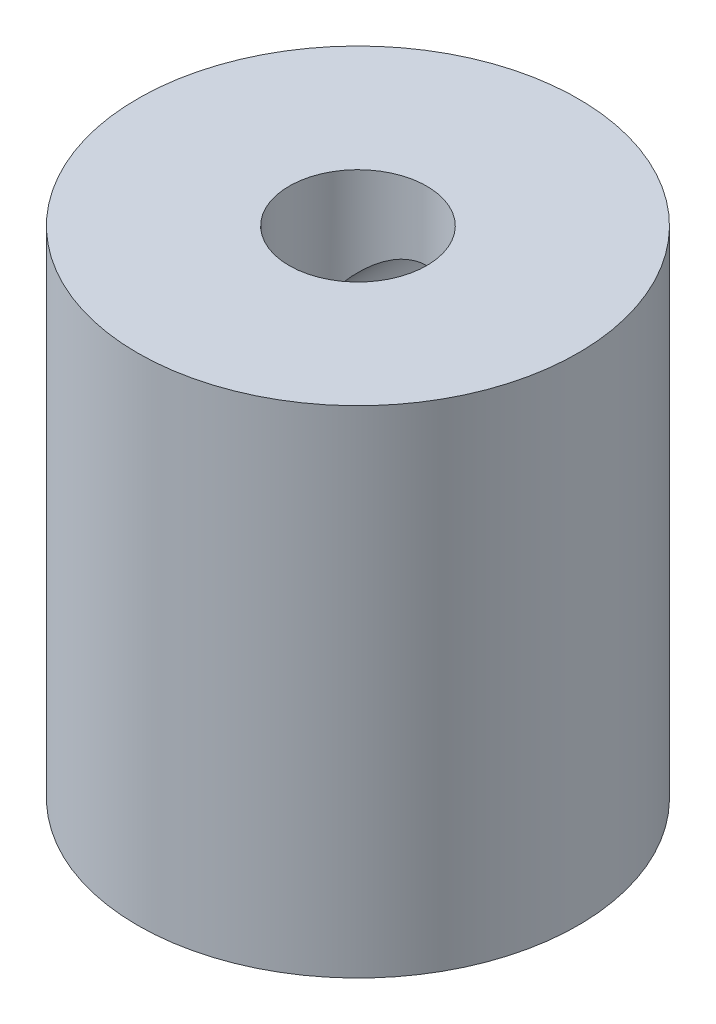
ISO-10303-21;
HEADER;
FILE_DESCRIPTION(('STEP AP214'),'2;1');
FILE_NAME('part.step','',(''),(''),'','','');
FILE_SCHEMA(('AUTOMOTIVE_DESIGN { 1 0 10303 214 1 1 1 1 }'));
ENDSEC;
DATA;
#1=APPLICATION_CONTEXT('core data for automotive mechanical design processes');
#2=APPLICATION_PROTOCOL_DEFINITION('international standard','automotive_design',2000,#1);
#3=PRODUCT_CONTEXT('',#1,'mechanical');
#4=PRODUCT('Part','Part','',(#3));
#5=PRODUCT_RELATED_PRODUCT_CATEGORY('part','',(#4));
#6=PRODUCT_DEFINITION_FORMATION('','',#4);
#7=PRODUCT_DEFINITION_CONTEXT('part definition',#1,'design');
#8=PRODUCT_DEFINITION('design','',#6,#7);
#9=PRODUCT_DEFINITION_SHAPE('','',#8);
#10=(LENGTH_UNIT() NAMED_UNIT(*) SI_UNIT(.MILLI.,.METRE.));
#11=(NAMED_UNIT(*) PLANE_ANGLE_UNIT() SI_UNIT($,.RADIAN.));
#12=(NAMED_UNIT(*) SI_UNIT($,.STERADIAN.) SOLID_ANGLE_UNIT());
#13=UNCERTAINTY_MEASURE_WITH_UNIT(LENGTH_MEASURE(1.E-05),#10,'distance_accuracy_value','');
#14=(GEOMETRIC_REPRESENTATION_CONTEXT(3) GLOBAL_UNCERTAINTY_ASSIGNED_CONTEXT((#13)) GLOBAL_UNIT_ASSIGNED_CONTEXT((#10,
#11,#12)) REPRESENTATION_CONTEXT('',''));
#15=CARTESIAN_POINT('',(0.,0.,0.));
#16=DIRECTION('',(0.,0.,1.));
#17=DIRECTION('',(1.,0.,0.));
#18=AXIS2_PLACEMENT_3D('',#15,#16,#17);
#19=CARTESIAN_POINT('',(0.,9.,0.));
#20=DIRECTION('',(0.,1.,0.));
#21=DIRECTION('',(0.,0.,1.));
#22=AXIS2_PLACEMENT_3D('',#19,#20,#21);
#23=PLANE('',#22);
#24=CARTESIAN_POINT('',(0.,9.,0.));
#25=DIRECTION('',(0.,1.,0.));
#26=DIRECTION('',(0.,0.,1.));
#27=AXIS2_PLACEMENT_3D('',#24,#25,#26);
#28=CIRCLE('',#27,4.);
#29=CARTESIAN_POINT('',(0.,9.,4.));
#30=VERTEX_POINT('',#29);
#31=EDGE_CURVE('E83',#30,#30,#28,.T.);
#32=ORIENTED_EDGE('',*,*,#31,.T.);
#33=EDGE_LOOP('',(#32));
#34=FACE_BOUND('',#33,.T.);
#35=CARTESIAN_POINT('',(0.,9.,0.));
#36=DIRECTION('',(0.,1.,0.));
#37=DIRECTION('',(0.,0.,1.));
#38=AXIS2_PLACEMENT_3D('',#35,#36,#37);
#39=CIRCLE('',#38,1.25);
#40=CARTESIAN_POINT('',(0.,9.,1.25));
#41=VERTEX_POINT('',#40);
#42=EDGE_CURVE('E70',#41,#41,#39,.T.);
#43=ORIENTED_EDGE('',*,*,#42,.F.);
#44=EDGE_LOOP('',(#43));
#45=FACE_BOUND('',#44,.T.);
#46=ADVANCED_FACE('F33',(#34,#45),#23,.T.);
#47=CARTESIAN_POINT('',(0.,0.,0.));
#48=DIRECTION('',(0.,1.,0.));
#49=DIRECTION('',(0.,0.,1.));
#50=AXIS2_PLACEMENT_3D('',#47,#48,#49);
#51=PLANE('',#50);
#52=CARTESIAN_POINT('',(0.,0.,0.));
#53=DIRECTION('',(0.,1.,0.));
#54=DIRECTION('',(0.,0.,1.));
#55=AXIS2_PLACEMENT_3D('',#52,#53,#54);
#56=CIRCLE('',#55,4.);
#57=CARTESIAN_POINT('',(0.,0.,4.));
#58=VERTEX_POINT('',#57);
#59=EDGE_CURVE('E77',#58,#58,#56,.T.);
#60=ORIENTED_EDGE('',*,*,#59,.F.);
#61=EDGE_LOOP('',(#60));
#62=FACE_BOUND('',#61,.T.);
#63=CARTESIAN_POINT('',(0.,0.,0.));
#64=DIRECTION('',(0.,1.,0.));
#65=DIRECTION('',(0.,0.,1.));
#66=AXIS2_PLACEMENT_3D('',#63,#64,#65);
#67=CIRCLE('',#66,1.25);
#68=CARTESIAN_POINT('',(0.,0.,1.25));
#69=VERTEX_POINT('',#68);
#70=EDGE_CURVE('E73',#69,#69,#67,.T.);
#71=ORIENTED_EDGE('',*,*,#70,.T.);
#72=EDGE_LOOP('',(#71));
#73=FACE_BOUND('',#72,.T.);
#74=ADVANCED_FACE('F97',(#62,#73),#51,.F.);
#75=CARTESIAN_POINT('',(0.,9.,0.));
#76=DIRECTION('',(0.,-1.,0.));
#77=DIRECTION('',(0.,0.,-1.));
#78=AXIS2_PLACEMENT_3D('',#75,#76,#77);
#79=CYLINDRICAL_SURFACE('',#78,4.);
#80=CARTESIAN_POINT('',(0.,3.75,-4.));
#81=CARTESIAN_POINT('',(-0.0684391851745465,3.74999955341242,-3.99999965877989));
#82=CARTESIAN_POINT('',(-0.136883052502859,3.74436077305555,-3.99822694984841));
#83=CARTESIAN_POINT('',(-0.271769209588448,3.72201375846076,-3.99132894088807));
#84=CARTESIAN_POINT('',(-0.338211042725907,3.70530301863564,-3.9862028819986));
#85=CARTESIAN_POINT('',(-0.467128543650807,3.66143062880426,-3.97315815697909));
#86=CARTESIAN_POINT('',(-0.529610176985804,3.63428515534703,-3.96524381499025));
#87=CARTESIAN_POINT('',(-0.64913480234646,3.57038268232167,-3.94743969161093));
#88=CARTESIAN_POINT('',(-0.706176935444885,3.53362416821941,-3.93754959899905));
#89=CARTESIAN_POINT('',(-0.814965334952281,3.45034400798264,-3.91650213740282));
#90=CARTESIAN_POINT('',(-0.86652002815666,3.40357911493893,-3.90531715926989));
#91=CARTESIAN_POINT('',(-0.961197382036993,3.30213160758645,-3.88310046374208));
#92=CARTESIAN_POINT('',(-1.0043184728987,3.24744752250545,-3.87206877523457));
#93=CARTESIAN_POINT('',(-1.08194336483114,3.13005543619192,-3.85111144698172));
#94=CARTESIAN_POINT('',(-1.11620784150129,3.06718252247278,-3.84121988301796));
#95=CARTESIAN_POINT('',(-1.17359741076672,2.93620768501813,-3.82407801799234));
#96=CARTESIAN_POINT('',(-1.19672543771945,2.86810714420607,-3.81682702128688));
#97=CARTESIAN_POINT('',(-1.23048459930033,2.73077192254794,-3.80607606984501));
#98=CARTESIAN_POINT('',(-1.24147110007865,2.66163315636115,-3.80246972929508));
#99=CARTESIAN_POINT('',(-1.25174555036988,2.52240688108811,-3.7991005514095));
#100=CARTESIAN_POINT('',(-1.25103660995772,2.45231962917834,-3.79933669227334));
#101=CARTESIAN_POINT('',(-1.23821824732739,2.31612553973102,-3.80353189075438));
#102=CARTESIAN_POINT('',(-1.22656057869383,2.24997087413843,-3.80734341745949));
#103=CARTESIAN_POINT('',(-1.19290813355626,2.12060784346265,-3.81802025652489));
#104=CARTESIAN_POINT('',(-1.17091225844551,2.0573997922912,-3.82488589343115));
#105=CARTESIAN_POINT('',(-1.11688874681277,1.93464805556736,-3.84101044014297));
#106=CARTESIAN_POINT('',(-1.08471925662082,1.87517138930802,-3.85030284660824));
#107=CARTESIAN_POINT('',(-1.01136020737848,1.76231223212088,-3.8702185658007));
#108=CARTESIAN_POINT('',(-0.970168305215773,1.70893132974629,-3.88084222394551));
#109=CARTESIAN_POINT('',(-0.877716954182124,1.60722505658301,-3.90281527800493));
#110=CARTESIAN_POINT('',(-0.826084570592817,1.55924044222032,-3.91417569605696));
#111=CARTESIAN_POINT('',(-0.715364408095531,1.47252810642032,-3.9359157075958));
#112=CARTESIAN_POINT('',(-0.65627607734902,1.43380107078079,-3.94629522838372));
#113=CARTESIAN_POINT('',(-0.531664610465454,1.36647231139872,-3.96501294890191));
#114=CARTESIAN_POINT('',(-0.466094906919279,1.33795186453603,-3.97333460648208));
#115=CARTESIAN_POINT('',(-0.330767977782644,1.29244699914843,-3.98687955828554));
#116=CARTESIAN_POINT('',(-0.261012030724608,1.2754590777616,-3.99210379325151));
#117=CARTESIAN_POINT('',(-0.122185157290344,1.25408195742102,-3.99871389395014));
#118=CARTESIAN_POINT('',(-0.0531918487888415,1.24923145640648,-4.00024022895439));
#119=CARTESIAN_POINT('',(0.0846303057325856,1.25096622663733,-3.99969799730981));
#120=CARTESIAN_POINT('',(0.153459174306506,1.2575498273226,-3.99762995581125));
#121=CARTESIAN_POINT('',(0.287219332975853,1.28159559260639,-3.99022363769772));
#122=CARTESIAN_POINT('',(0.352204978420949,1.29878326761252,-3.98496793110725));
#123=CARTESIAN_POINT('',(0.478351928861366,1.34321435236669,-3.97180121379252));
#124=CARTESIAN_POINT('',(0.539512760449017,1.37045900402491,-3.96388987514203));
#125=CARTESIAN_POINT('',(0.657932406672232,1.43497321654879,-3.94598542759568));
#126=CARTESIAN_POINT('',(0.715059739787956,1.47247098749722,-3.9359462681821));
#127=CARTESIAN_POINT('',(0.822365850960096,1.55615321011702,-3.91493410002887));
#128=CARTESIAN_POINT('',(0.872542738043337,1.60234001774311,-3.90396083845862));
#129=CARTESIAN_POINT('',(0.966587462919657,1.70425889005369,-3.88176994885247));
#130=CARTESIAN_POINT('',(1.01012652339774,1.76029666374526,-3.87055986714446));
#131=CARTESIAN_POINT('',(1.08721250244909,1.87912661637074,-3.84961947087602));
#132=CARTESIAN_POINT('',(1.12075957972524,1.94191868800443,-3.839889132814));
#133=CARTESIAN_POINT('',(1.17670083481141,2.07234517288586,-3.82311782360754));
#134=CARTESIAN_POINT('',(1.19913819558886,2.1399596495047,-3.81606646468027));
#135=CARTESIAN_POINT('',(1.23222894320964,2.2782724933238,-3.80551170941212));
#136=CARTESIAN_POINT('',(1.2428868141461,2.34896967637132,-3.80200696302675));
#137=CARTESIAN_POINT('',(1.2517940615754,2.48800408755424,-3.79908292712494));
#138=CARTESIAN_POINT('',(1.25058279621957,2.55630345381293,-3.79948604683077));
#139=CARTESIAN_POINT('',(1.23708818129474,2.69167458491918,-3.80390090472383));
#140=CARTESIAN_POINT('',(1.22480534822559,2.758746406884,-3.80791247457319));
#141=CARTESIAN_POINT('',(1.18987729913378,2.88879403960178,-3.81896814158112));
#142=CARTESIAN_POINT('',(1.16738642405944,2.95181544109602,-3.82596698183474));
#143=CARTESIAN_POINT('',(1.11280227335064,3.07324041353135,-3.84219704261348));
#144=CARTESIAN_POINT('',(1.08070704444254,3.13164304207768,-3.85142871716522));
#145=CARTESIAN_POINT('',(1.00635675013475,3.24464597044057,-3.8715348703158));
#146=CARTESIAN_POINT('',(0.963753335241273,3.29900812950044,-3.88245948922441));
#147=CARTESIAN_POINT('',(0.870208996404848,3.3999863281118,-3.90448998821726));
#148=CARTESIAN_POINT('',(0.819265842344402,3.44660028899101,-3.91559591606795));
#149=CARTESIAN_POINT('',(0.708486662823332,3.53228253836299,-3.93717271952329));
#150=CARTESIAN_POINT('',(0.64841457448738,3.57105473644997,-3.94761101730634));
#151=CARTESIAN_POINT('',(0.522279138013653,3.63789891513944,-3.96626769296916));
#152=CARTESIAN_POINT('',(0.456218157795448,3.66597510214183,-3.97448694315832));
#153=CARTESIAN_POINT('',(0.325747635373976,3.70859136760847,-3.98720650733461));
#154=CARTESIAN_POINT('',(0.261670337112545,3.72407486730534,-3.99196240806139));
#155=CARTESIAN_POINT('',(0.131729895440247,3.74477835996771,-3.99835900340486));
#156=CARTESIAN_POINT('',(0.0658671161396745,3.750000429804,-4.00000032839644));
#157=CARTESIAN_POINT('',(0.,3.75,-4.));
#158=B_SPLINE_CURVE_WITH_KNOTS('',3,(#80,#81,#82,#83,#84,#85,#86,#87,#88,#89,#90,#91,#92,#93,
#94,#95,#96,#97,#98,#99,#100,#101,#102,#103,#104,#105,#106,#107,#108,#109,#110,#111,#112,#113,
#114,#115,#116,#117,#118,#119,#120,#121,#122,#123,#124,#125,#126,#127,#128,#129,#130,#131,#132,
#133,#134,#135,#136,#137,#138,#139,#140,#141,#142,#143,#144,#145,#146,#147,#148,#149,#150,#151,
#152,#153,#154,#155,#156,#157),.UNSPECIFIED.,.T.,.F.,(4,2,2,2,2,2,2,2,2,2,2,2,2,2,2,2,2,2,2,2,2,
2,2,2,2,2,2,2,2,2,2,2,2,2,2,2,2,2,4),(0.,0.20507544943251,0.410197323349067,0.615002479202437,
0.819839921558392,1.03037822195158,1.24095567431276,1.45673771247494,1.67246286279527,
1.8816915016721,2.09086450295138,2.29176917422169,2.49269519979063,2.69655642720545,
2.90047066010359,3.113667472796,3.32688007413303,3.5417546068977,3.75656384494554,
3.96307568548238,4.16955735649363,4.37090626722872,4.572280050345,4.77856324738343,
4.98490245709259,5.1994177871314,5.41392970983712,5.62760115751032,5.84119123892431,
6.04512203476054,6.24904331751085,6.44997913396672,6.65095584330174,6.85979514006362,
7.06869037373341,7.28440668126413,7.50003806666338,7.69744636651541,7.89481470763048),.UNSPECIFIED.);
#159=CARTESIAN_POINT('',(0.,3.75,-4.));
#160=VERTEX_POINT('',#159);
#161=EDGE_CURVE('E80',#160,#160,#158,.T.);
#162=ORIENTED_EDGE('',*,*,#161,.T.);
#163=EDGE_LOOP('',(#162));
#164=FACE_BOUND('',#163,.T.);
#165=CARTESIAN_POINT('',(0.,7.75,-4.));
#166=CARTESIAN_POINT('',(-0.0684391851745465,7.74999955341242,-3.99999965877989));
#167=CARTESIAN_POINT('',(-0.136883052502859,7.74436077305555,-3.99822694984841));
#168=CARTESIAN_POINT('',(-0.271769209588448,7.72201375846076,-3.99132894088807));
#169=CARTESIAN_POINT('',(-0.338211042725907,7.70530301863564,-3.9862028819986));
#170=CARTESIAN_POINT('',(-0.467128543650807,7.66143062880426,-3.97315815697909));
#171=CARTESIAN_POINT('',(-0.529610176985804,7.63428515534703,-3.96524381499025));
#172=CARTESIAN_POINT('',(-0.64913480234646,7.57038268232167,-3.94743969161093));
#173=CARTESIAN_POINT('',(-0.706176935444885,7.53362416821941,-3.93754959899905));
#174=CARTESIAN_POINT('',(-0.814965334952281,7.45034400798264,-3.91650213740282));
#175=CARTESIAN_POINT('',(-0.86652002815666,7.40357911493893,-3.90531715926989));
#176=CARTESIAN_POINT('',(-0.961197382036994,7.30213160758645,-3.88310046374208));
#177=CARTESIAN_POINT('',(-1.0043184728987,7.24744752250545,-3.87206877523457));
#178=CARTESIAN_POINT('',(-1.08194336483114,7.13005543619192,-3.85111144698172));
#179=CARTESIAN_POINT('',(-1.11620784150129,7.06718252247278,-3.84121988301796));
#180=CARTESIAN_POINT('',(-1.17359741076672,6.93620768501813,-3.82407801799234));
#181=CARTESIAN_POINT('',(-1.19672543771945,6.86810714420607,-3.81682702128689));
#182=CARTESIAN_POINT('',(-1.23048459930033,6.73077192254794,-3.80607606984501));
#183=CARTESIAN_POINT('',(-1.24147110007865,6.66163315636115,-3.80246972929508));
#184=CARTESIAN_POINT('',(-1.25174555036988,6.52240688108811,-3.7991005514095));
#185=CARTESIAN_POINT('',(-1.25103660995772,6.45231962917834,-3.79933669227334));
#186=CARTESIAN_POINT('',(-1.23821824732739,6.31612553973102,-3.80353189075438));
#187=CARTESIAN_POINT('',(-1.22656057869383,6.24997087413843,-3.80734341745949));
#188=CARTESIAN_POINT('',(-1.19290813355626,6.12060784346265,-3.81802025652489));
#189=CARTESIAN_POINT('',(-1.17091225844551,6.0573997922912,-3.82488589343115));
#190=CARTESIAN_POINT('',(-1.11688874681277,5.93464805556737,-3.84101044014296));
#191=CARTESIAN_POINT('',(-1.08471925662082,5.87517138930802,-3.85030284660824));
#192=CARTESIAN_POINT('',(-1.01136020737848,5.76231223212088,-3.8702185658007));
#193=CARTESIAN_POINT('',(-0.970168305215774,5.70893132974629,-3.88084222394551));
#194=CARTESIAN_POINT('',(-0.877716954182124,5.60722505658301,-3.90281527800493));
#195=CARTESIAN_POINT('',(-0.826084570592818,5.55924044222032,-3.91417569605696));
#196=CARTESIAN_POINT('',(-0.715364408095531,5.47252810642032,-3.9359157075958));
#197=CARTESIAN_POINT('',(-0.656276077349021,5.43380107078079,-3.94629522838372));
#198=CARTESIAN_POINT('',(-0.531664610465455,5.36647231139872,-3.96501294890191));
#199=CARTESIAN_POINT('',(-0.466094906919279,5.33795186453603,-3.97333460648208));
#200=CARTESIAN_POINT('',(-0.330767977782644,5.29244699914843,-3.98687955828554));
#201=CARTESIAN_POINT('',(-0.261012030724609,5.2754590777616,-3.99210379325151));
#202=CARTESIAN_POINT('',(-0.122185157290345,5.25408195742102,-3.99871389395014));
#203=CARTESIAN_POINT('',(-0.0531918487888424,5.24923145640648,-4.00024022895439));
#204=CARTESIAN_POINT('',(0.0846303057325846,5.25096622663733,-3.99969799730981));
#205=CARTESIAN_POINT('',(0.153459174306505,5.2575498273226,-3.99762995581125));
#206=CARTESIAN_POINT('',(0.287219332975852,5.28159559260639,-3.99022363769772));
#207=CARTESIAN_POINT('',(0.352204978420948,5.29878326761251,-3.98496793110725));
#208=CARTESIAN_POINT('',(0.478351928861365,5.34321435236669,-3.97180121379252));
#209=CARTESIAN_POINT('',(0.539512760449016,5.3704590040249,-3.96388987514203));
#210=CARTESIAN_POINT('',(0.657932406672231,5.43497321654879,-3.94598542759568));
#211=CARTESIAN_POINT('',(0.715059739787955,5.47247098749722,-3.9359462681821));
#212=CARTESIAN_POINT('',(0.822365850960095,5.55615321011701,-3.91493410002887));
#213=CARTESIAN_POINT('',(0.872542738043336,5.60234001774311,-3.90396083845862));
#214=CARTESIAN_POINT('',(0.966587462919656,5.70425889005368,-3.88176994885247));
#215=CARTESIAN_POINT('',(1.01012652339774,5.76029666374526,-3.87055986714446));
#216=CARTESIAN_POINT('',(1.08721250244909,5.87912661637074,-3.84961947087602));
#217=CARTESIAN_POINT('',(1.12075957972524,5.94191868800443,-3.839889132814));
#218=CARTESIAN_POINT('',(1.17670083481141,6.07234517288586,-3.82311782360754));
#219=CARTESIAN_POINT('',(1.19913819558886,6.1399596495047,-3.81606646468027));
#220=CARTESIAN_POINT('',(1.23222894320964,6.27827249332379,-3.80551170941212));
#221=CARTESIAN_POINT('',(1.2428868141461,6.34896967637131,-3.80200696302675));
#222=CARTESIAN_POINT('',(1.2517940615754,6.48800408755424,-3.79908292712494));
#223=CARTESIAN_POINT('',(1.25058279621957,6.55630345381293,-3.79948604683077));
#224=CARTESIAN_POINT('',(1.23708818129474,6.69167458491918,-3.80390090472383));
#225=CARTESIAN_POINT('',(1.22480534822559,6.758746406884,-3.80791247457319));
#226=CARTESIAN_POINT('',(1.18987729913378,6.88879403960178,-3.81896814158112));
#227=CARTESIAN_POINT('',(1.16738642405944,6.95181544109601,-3.82596698183474));
#228=CARTESIAN_POINT('',(1.11280227335064,7.07324041353135,-3.84219704261348));
#229=CARTESIAN_POINT('',(1.08070704444254,7.13164304207768,-3.85142871716522));
#230=CARTESIAN_POINT('',(1.00635675013475,7.24464597044056,-3.8715348703158));
#231=CARTESIAN_POINT('',(0.963753335241274,7.29900812950044,-3.88245948922441));
#232=CARTESIAN_POINT('',(0.870208996404848,7.3999863281118,-3.90448998821726));
#233=CARTESIAN_POINT('',(0.819265842344403,7.446600288991,-3.91559591606795));
#234=CARTESIAN_POINT('',(0.708486662823332,7.53228253836299,-3.93717271952329));
#235=CARTESIAN_POINT('',(0.64841457448738,7.57105473644997,-3.94761101730634));
#236=CARTESIAN_POINT('',(0.522279138013654,7.63789891513944,-3.96626769296916));
#237=CARTESIAN_POINT('',(0.456218157795449,7.66597510214183,-3.97448694315832));
#238=CARTESIAN_POINT('',(0.325747635373978,7.70859136760847,-3.98720650733461));
#239=CARTESIAN_POINT('',(0.261670337112546,7.72407486730534,-3.99196240806139));
#240=CARTESIAN_POINT('',(0.131729895440248,7.74477835996771,-3.99835900340486));
#241=CARTESIAN_POINT('',(0.0658671161396747,7.750000429804,-4.00000032839644));
#242=CARTESIAN_POINT('',(0.,7.75,-4.));
#243=B_SPLINE_CURVE_WITH_KNOTS('',3,(#165,#166,#167,#168,#169,#170,#171,#172,#173,#174,#175,
#176,#177,#178,#179,#180,#181,#182,#183,#184,#185,#186,#187,#188,#189,#190,#191,#192,#193,#194,
#195,#196,#197,#198,#199,#200,#201,#202,#203,#204,#205,#206,#207,#208,#209,#210,#211,#212,#213,
#214,#215,#216,#217,#218,#219,#220,#221,#222,#223,#224,#225,#226,#227,#228,#229,#230,#231,#232,
#233,#234,#235,#236,#237,#238,#239,#240,#241,#242),.UNSPECIFIED.,.T.,.F.,(4,2,2,2,2,2,2,2,2,2,2,
2,2,2,2,2,2,2,2,2,2,2,2,2,2,2,2,2,2,2,2,2,2,2,2,2,2,2,4),(0.,0.20507544943251,0.410197323349067,
0.615002479202436,0.819839921558392,1.03037822195158,1.24095567431276,1.45673771247494,
1.67246286279527,1.8816915016721,2.09086450295138,2.29176917422169,2.49269519979063,
2.69655642720545,2.90047066010359,3.113667472796,3.32688007413303,3.5417546068977,
3.75656384494554,3.96307568548238,4.16955735649363,4.37090626722872,4.572280050345,
4.77856324738343,4.9849024570926,5.1994177871314,5.41392970983713,5.62760115751032,
5.84119123892431,6.04512203476054,6.24904331751085,6.44997913396672,6.65095584330174,
6.85979514006362,7.06869037373341,7.28440668126413,7.50003806666338,7.69744636651542,
7.89481470763048),.UNSPECIFIED.);
#244=CARTESIAN_POINT('',(0.,7.75,-4.));
#245=VERTEX_POINT('',#244);
#246=EDGE_CURVE('E75',#245,#245,#243,.T.);
#247=ORIENTED_EDGE('',*,*,#246,.T.);
#248=EDGE_LOOP('',(#247));
#249=FACE_BOUND('',#248,.T.);
#250=ORIENTED_EDGE('',*,*,#31,.F.);
#251=EDGE_LOOP('',(#250));
#252=FACE_BOUND('',#251,.T.);
#253=ORIENTED_EDGE('',*,*,#59,.T.);
#254=EDGE_LOOP('',(#253));
#255=FACE_BOUND('',#254,.T.);
#256=ADVANCED_FACE('F35',(#164,#249,#252,#255),#79,.T.);
#257=CARTESIAN_POINT('',(0.,9.,0.));
#258=DIRECTION('',(0.,-1.,0.));
#259=DIRECTION('',(0.,0.,-1.));
#260=AXIS2_PLACEMENT_3D('',#257,#258,#259);
#261=CYLINDRICAL_SURFACE('',#260,1.25);
#262=CARTESIAN_POINT('',(0.,2.5,0.));
#263=DIRECTION('',(0.,-0.707106781186547,0.707106781186547));
#264=DIRECTION('',(0.,-0.707106781186547,-0.707106781186547));
#265=AXIS2_PLACEMENT_3D('',#262,#263,#264);
#266=ELLIPSE('',#265,1.76776695296637,1.25);
#267=CARTESIAN_POINT('',(-1.25,2.5,0.));
#268=VERTEX_POINT('',#267);
#269=CARTESIAN_POINT('',(1.25,2.5,0.));
#270=VERTEX_POINT('',#269);
#271=EDGE_CURVE('E11',#268,#270,#266,.T.);
#272=ORIENTED_EDGE('',*,*,#271,.F.);
#273=CARTESIAN_POINT('',(0.,2.5,0.));
#274=DIRECTION('',(0.,-0.707106781186547,-0.707106781186547));
#275=DIRECTION('',(0.,-0.707106781186547,0.707106781186547));
#276=AXIS2_PLACEMENT_3D('',#273,#274,#275);
#277=ELLIPSE('',#276,1.76776695296637,1.25);
#278=EDGE_CURVE('E42',#270,#268,#277,.F.);
#279=ORIENTED_EDGE('',*,*,#278,.F.);
#280=EDGE_LOOP('',(#272,#279));
#281=FACE_BOUND('',#280,.T.);
#282=CARTESIAN_POINT('',(0.,6.5,0.));
#283=DIRECTION('',(0.,-0.707106781186547,0.707106781186547));
#284=DIRECTION('',(0.,-0.707106781186547,-0.707106781186547));
#285=AXIS2_PLACEMENT_3D('',#282,#283,#284);
#286=ELLIPSE('',#285,1.76776695296637,1.25);
#287=CARTESIAN_POINT('',(-1.25,6.5,0.));
#288=VERTEX_POINT('',#287);
#289=CARTESIAN_POINT('',(1.25,6.5,0.));
#290=VERTEX_POINT('',#289);
#291=EDGE_CURVE('E53',#288,#290,#286,.T.);
#292=ORIENTED_EDGE('',*,*,#291,.F.);
#293=CARTESIAN_POINT('',(0.,6.5,0.));
#294=DIRECTION('',(0.,-0.707106781186547,-0.707106781186547));
#295=DIRECTION('',(0.,-0.707106781186547,0.707106781186547));
#296=AXIS2_PLACEMENT_3D('',#293,#294,#295);
#297=ELLIPSE('',#296,1.76776695296637,1.25);
#298=EDGE_CURVE('E86',#290,#288,#297,.F.);
#299=ORIENTED_EDGE('',*,*,#298,.F.);
#300=EDGE_LOOP('',(#292,#299));
#301=FACE_BOUND('',#300,.T.);
#302=ORIENTED_EDGE('',*,*,#42,.T.);
#303=EDGE_LOOP('',(#302));
#304=FACE_BOUND('',#303,.T.);
#305=ORIENTED_EDGE('',*,*,#70,.F.);
#306=EDGE_LOOP('',(#305));
#307=FACE_BOUND('',#306,.T.);
#308=ADVANCED_FACE('F61',(#281,#301,#304,#307),#261,.F.);
#309=CARTESIAN_POINT('',(0.,6.5,-9.));
#310=DIRECTION('',(0.,0.,1.));
#311=DIRECTION('',(1.,0.,0.));
#312=AXIS2_PLACEMENT_3D('',#309,#310,#311);
#313=CYLINDRICAL_SURFACE('',#312,1.25);
#314=ORIENTED_EDGE('',*,*,#291,.T.);
#315=ORIENTED_EDGE('',*,*,#298,.T.);
#316=EDGE_LOOP('',(#314,#315));
#317=FACE_BOUND('',#316,.T.);
#318=ORIENTED_EDGE('',*,*,#246,.F.);
#319=EDGE_LOOP('',(#318));
#320=FACE_BOUND('',#319,.T.);
#321=ADVANCED_FACE('F64',(#317,#320),#313,.F.);
#322=CARTESIAN_POINT('',(0.,2.5,-9.));
#323=DIRECTION('',(0.,0.,1.));
#324=DIRECTION('',(1.,0.,0.));
#325=AXIS2_PLACEMENT_3D('',#322,#323,#324);
#326=CYLINDRICAL_SURFACE('',#325,1.25);
#327=ORIENTED_EDGE('',*,*,#271,.T.);
#328=ORIENTED_EDGE('',*,*,#278,.T.);
#329=EDGE_LOOP('',(#327,#328));
#330=FACE_BOUND('',#329,.T.);
#331=ORIENTED_EDGE('',*,*,#161,.F.);
#332=EDGE_LOOP('',(#331));
#333=FACE_BOUND('',#332,.T.);
#334=ADVANCED_FACE('F58',(#330,#333),#326,.F.);
#335=CLOSED_SHELL('',(#46,#74,#256,#308,#321,#334));
#336=MANIFOLD_SOLID_BREP('B2',#335);
#337=ADVANCED_BREP_SHAPE_REPRESENTATION('',(#18,#336),#14);
#338=SHAPE_DEFINITION_REPRESENTATION(#9,#337);
ENDSEC;
END-ISO-10303-21;
